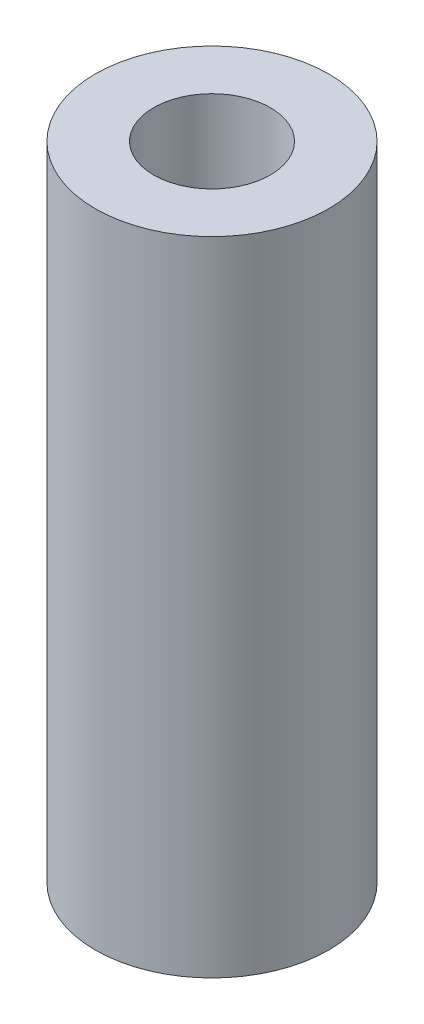
ISO-10303-21;
HEADER;
FILE_DESCRIPTION(('STEP AP214'),'2;1');
FILE_NAME('part.step','',(''),(''),'','','');
FILE_SCHEMA(('AUTOMOTIVE_DESIGN { 1 0 10303 214 1 1 1 1 }'));
ENDSEC;
DATA;
#1=APPLICATION_CONTEXT('core data for automotive mechanical design processes');
#2=APPLICATION_PROTOCOL_DEFINITION('international standard','automotive_design',2000,#1);
#3=PRODUCT_CONTEXT('',#1,'mechanical');
#4=PRODUCT('Part','Part','',(#3));
#5=PRODUCT_RELATED_PRODUCT_CATEGORY('part','',(#4));
#6=PRODUCT_DEFINITION_FORMATION('','',#4);
#7=PRODUCT_DEFINITION_CONTEXT('part definition',#1,'design');
#8=PRODUCT_DEFINITION('design','',#6,#7);
#9=PRODUCT_DEFINITION_SHAPE('','',#8);
#10=(LENGTH_UNIT() NAMED_UNIT(*) SI_UNIT(.MILLI.,.METRE.));
#11=(NAMED_UNIT(*) PLANE_ANGLE_UNIT() SI_UNIT($,.RADIAN.));
#12=(NAMED_UNIT(*) SI_UNIT($,.STERADIAN.) SOLID_ANGLE_UNIT());
#13=UNCERTAINTY_MEASURE_WITH_UNIT(LENGTH_MEASURE(1.E-05),#10,'distance_accuracy_value','');
#14=(GEOMETRIC_REPRESENTATION_CONTEXT(3) GLOBAL_UNCERTAINTY_ASSIGNED_CONTEXT((#13)) GLOBAL_UNIT_ASSIGNED_CONTEXT((#10,
#11,#12)) REPRESENTATION_CONTEXT('',''));
#15=CARTESIAN_POINT('',(0.,0.,0.));
#16=DIRECTION('',(0.,0.,1.));
#17=DIRECTION('',(1.,0.,0.));
#18=AXIS2_PLACEMENT_3D('',#15,#16,#17);
#19=CARTESIAN_POINT('',(0.,34.925,0.));
#20=DIRECTION('',(0.,1.,0.));
#21=DIRECTION('',(0.,0.,1.));
#22=AXIS2_PLACEMENT_3D('',#19,#20,#21);
#23=PLANE('',#22);
#24=CARTESIAN_POINT('',(0.,34.925,0.));
#25=DIRECTION('',(0.,1.,0.));
#26=DIRECTION('',(0.,0.,1.));
#27=AXIS2_PLACEMENT_3D('',#24,#25,#26);
#28=CIRCLE('',#27,6.35);
#29=CARTESIAN_POINT('',(0.,34.925,6.35));
#30=VERTEX_POINT('',#29);
#31=EDGE_CURVE('E10',#30,#30,#28,.T.);
#32=ORIENTED_EDGE('',*,*,#31,.T.);
#33=EDGE_LOOP('',(#32));
#34=FACE_BOUND('',#33,.T.);
#35=CARTESIAN_POINT('',(0.,34.925,0.));
#36=DIRECTION('',(0.,1.,0.));
#37=DIRECTION('',(0.,0.,1.));
#38=AXIS2_PLACEMENT_3D('',#35,#36,#37);
#39=CIRCLE('',#38,3.175);
#40=CARTESIAN_POINT('',(0.,34.925,3.175));
#41=VERTEX_POINT('',#40);
#42=EDGE_CURVE('E44',#41,#41,#39,.T.);
#43=ORIENTED_EDGE('',*,*,#42,.F.);
#44=EDGE_LOOP('',(#43));
#45=FACE_BOUND('',#44,.T.);
#46=ADVANCED_FACE('F33',(#34,#45),#23,.T.);
#47=CARTESIAN_POINT('',(0.,0.,0.));
#48=DIRECTION('',(0.,1.,0.));
#49=DIRECTION('',(0.,0.,1.));
#50=AXIS2_PLACEMENT_3D('',#47,#48,#49);
#51=PLANE('',#50);
#52=CARTESIAN_POINT('',(0.,0.,0.));
#53=DIRECTION('',(0.,1.,0.));
#54=DIRECTION('',(0.,0.,1.));
#55=AXIS2_PLACEMENT_3D('',#52,#53,#54);
#56=CIRCLE('',#55,6.35);
#57=CARTESIAN_POINT('',(0.,0.,6.35));
#58=VERTEX_POINT('',#57);
#59=EDGE_CURVE('E37',#58,#58,#56,.T.);
#60=ORIENTED_EDGE('',*,*,#59,.F.);
#61=EDGE_LOOP('',(#60));
#62=FACE_BOUND('',#61,.T.);
#63=CARTESIAN_POINT('',(0.,0.,0.));
#64=DIRECTION('',(0.,1.,0.));
#65=DIRECTION('',(0.,0.,1.));
#66=AXIS2_PLACEMENT_3D('',#63,#64,#65);
#67=CIRCLE('',#66,3.175);
#68=CARTESIAN_POINT('',(0.,0.,3.175));
#69=VERTEX_POINT('',#68);
#70=EDGE_CURVE('E46',#69,#69,#67,.T.);
#71=ORIENTED_EDGE('',*,*,#70,.T.);
#72=EDGE_LOOP('',(#71));
#73=FACE_BOUND('',#72,.T.);
#74=ADVANCED_FACE('F56',(#62,#73),#51,.F.);
#75=CARTESIAN_POINT('',(0.,34.925,0.));
#76=DIRECTION('',(0.,-1.,0.));
#77=DIRECTION('',(0.,0.,-1.));
#78=AXIS2_PLACEMENT_3D('',#75,#76,#77);
#79=CYLINDRICAL_SURFACE('',#78,6.35);
#80=ORIENTED_EDGE('',*,*,#31,.F.);
#81=EDGE_LOOP('',(#80));
#82=FACE_BOUND('',#81,.T.);
#83=ORIENTED_EDGE('',*,*,#59,.T.);
#84=EDGE_LOOP('',(#83));
#85=FACE_BOUND('',#84,.T.);
#86=ADVANCED_FACE('F35',(#82,#85),#79,.T.);
#87=CARTESIAN_POINT('',(0.,34.925,0.));
#88=DIRECTION('',(0.,-1.,0.));
#89=DIRECTION('',(0.,0.,-1.));
#90=AXIS2_PLACEMENT_3D('',#87,#88,#89);
#91=CYLINDRICAL_SURFACE('',#90,3.175);
#92=ORIENTED_EDGE('',*,*,#42,.T.);
#93=EDGE_LOOP('',(#92));
#94=FACE_BOUND('',#93,.T.);
#95=ORIENTED_EDGE('',*,*,#70,.F.);
#96=EDGE_LOOP('',(#95));
#97=FACE_BOUND('',#96,.T.);
#98=ADVANCED_FACE('F52',(#94,#97),#91,.F.);
#99=CLOSED_SHELL('',(#46,#74,#86,#98));
#100=MANIFOLD_SOLID_BREP('B2',#99);
#101=ADVANCED_BREP_SHAPE_REPRESENTATION('',(#18,#100),#14);
#102=SHAPE_DEFINITION_REPRESENTATION(#9,#101);
ENDSEC;
END-ISO-10303-21;
